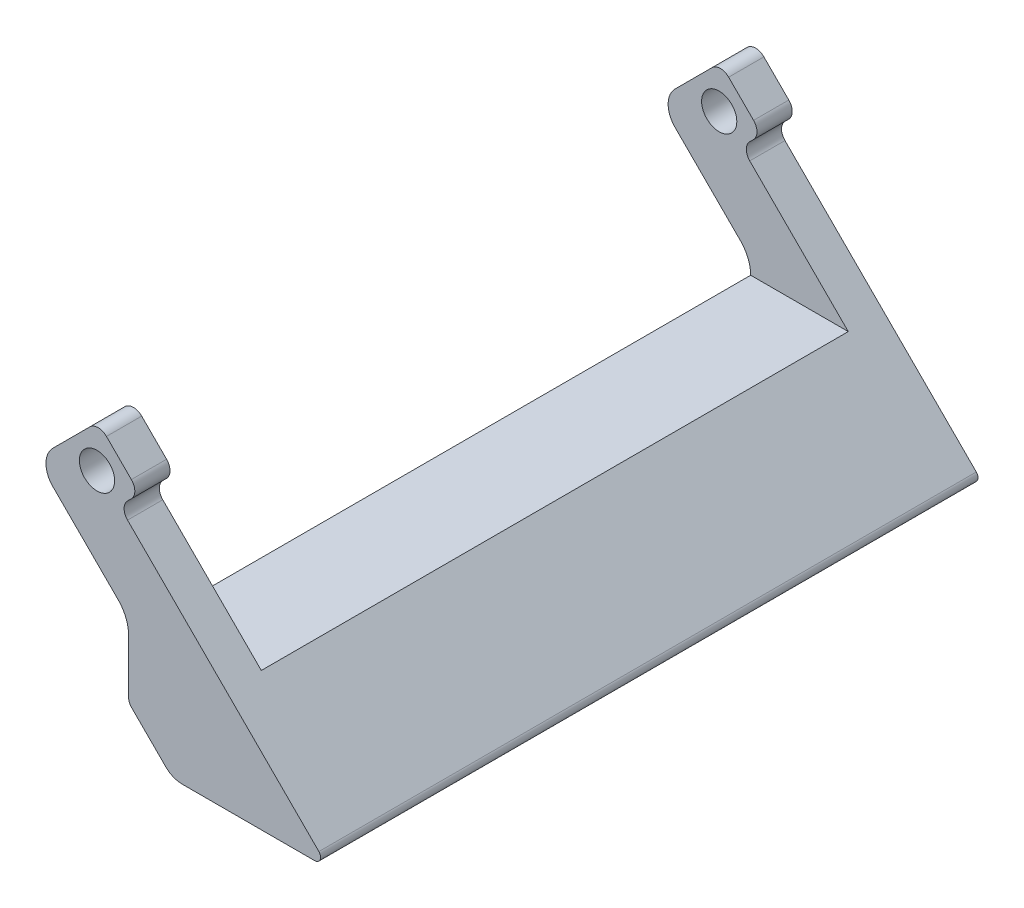
ISO-10303-21;
HEADER;
FILE_DESCRIPTION(('STEP AP214'),'2;1');
FILE_NAME('part.step','',(''),(''),'','','');
FILE_SCHEMA(('AUTOMOTIVE_DESIGN { 1 0 10303 214 1 1 1 1 }'));
ENDSEC;
DATA;
#1=APPLICATION_CONTEXT('core data for automotive mechanical design processes');
#2=APPLICATION_PROTOCOL_DEFINITION('international standard','automotive_design',2000,#1);
#3=PRODUCT_CONTEXT('',#1,'mechanical');
#4=PRODUCT('Part','Part','',(#3));
#5=PRODUCT_RELATED_PRODUCT_CATEGORY('part','',(#4));
#6=PRODUCT_DEFINITION_FORMATION('','',#4);
#7=PRODUCT_DEFINITION_CONTEXT('part definition',#1,'design');
#8=PRODUCT_DEFINITION('design','',#6,#7);
#9=PRODUCT_DEFINITION_SHAPE('','',#8);
#10=(LENGTH_UNIT() NAMED_UNIT(*) SI_UNIT(.MILLI.,.METRE.));
#11=(NAMED_UNIT(*) PLANE_ANGLE_UNIT() SI_UNIT($,.RADIAN.));
#12=(NAMED_UNIT(*) SI_UNIT($,.STERADIAN.) SOLID_ANGLE_UNIT());
#13=UNCERTAINTY_MEASURE_WITH_UNIT(LENGTH_MEASURE(1.E-05),#10,'distance_accuracy_value','');
#14=(GEOMETRIC_REPRESENTATION_CONTEXT(3) GLOBAL_UNCERTAINTY_ASSIGNED_CONTEXT((#13)) GLOBAL_UNIT_ASSIGNED_CONTEXT((#10,
#11,#12)) REPRESENTATION_CONTEXT('',''));
#15=CARTESIAN_POINT('',(0.,0.,0.));
#16=DIRECTION('',(0.,0.,1.));
#17=DIRECTION('',(1.,0.,0.));
#18=AXIS2_PLACEMENT_3D('',#15,#16,#17);
#19=CARTESIAN_POINT('',(0.,0.,3.));
#20=DIRECTION('',(0.,0.,1.));
#21=DIRECTION('',(1.,0.,0.));
#22=AXIS2_PLACEMENT_3D('',#19,#20,#21);
#23=PLANE('',#22);
#24=CARTESIAN_POINT('',(0.,0.,3.));
#25=DIRECTION('',(0.,0.,1.));
#26=DIRECTION('',(1.,0.,0.));
#27=AXIS2_PLACEMENT_3D('',#24,#25,#26);
#28=CIRCLE('',#27,1.5);
#29=CARTESIAN_POINT('',(1.5,0.,3.));
#30=VERTEX_POINT('',#29);
#31=EDGE_CURVE('E338',#30,#30,#28,.T.);
#32=ORIENTED_EDGE('',*,*,#31,.F.);
#33=EDGE_LOOP('',(#32));
#34=FACE_BOUND('',#33,.T.);
#35=CARTESIAN_POINT('',(-0.317797590198112,-10.7426406871192,3.));
#36=DIRECTION('',(0.,0.,1.));
#37=DIRECTION('',(1.,0.,0.));
#38=AXIS2_PLACEMENT_3D('',#35,#36,#37);
#39=CIRCLE('',#38,3.);
#40=CARTESIAN_POINT('',(1.80352275336153,-8.62132034355954,3.));
#41=VERTEX_POINT('',#40);
#42=CARTESIAN_POINT('',(2.68220240980189,-10.7426406871192,3.));
#43=VERTEX_POINT('',#42);
#44=EDGE_CURVE('E345',#41,#43,#39,.F.);
#45=ORIENTED_EDGE('',*,*,#44,.T.);
#46=DIRECTION('',(1.,0.,0.));
#47=VECTOR('',#46,1.);
#48=CARTESIAN_POINT('',(0.,-10.7426406871192,3.));
#49=LINE('',#48,#47);
#50=CARTESIAN_POINT('',(10.9959109087866,-10.7426406871192,3.));
#51=VERTEX_POINT('',#50);
#52=EDGE_CURVE('E220',#43,#51,#49,.T.);
#53=ORIENTED_EDGE('',*,*,#52,.T.);
#54=DIRECTION('',(0.707106781186546,-0.707106781186549,0.));
#55=VECTOR('',#54,1.);
#56=CARTESIAN_POINT('',(0.126635110833742,0.126635110833742,3.));
#57=LINE('',#56,#55);
#58=CARTESIAN_POINT('',(2.60150884498665,-2.34823862331918,3.));
#59=VERTEX_POINT('',#58);
#60=EDGE_CURVE('E347',#59,#51,#57,.T.);
#61=ORIENTED_EDGE('',*,*,#60,.F.);
#62=CARTESIAN_POINT('',(3.3086156261732,-1.64113184213263,3.));
#63=DIRECTION('',(0.,0.,1.));
#64=DIRECTION('',(1.,0.,0.));
#65=AXIS2_PLACEMENT_3D('',#62,#63,#64);
#66=CIRCLE('',#65,1.);
#67=CARTESIAN_POINT('',(2.60150884498666,-0.934025060946084,3.));
#68=VERTEX_POINT('',#67);
#69=EDGE_CURVE('E350',#68,#59,#66,.T.);
#70=ORIENTED_EDGE('',*,*,#69,.F.);
#71=DIRECTION('',(0.707106781186547,0.707106781186548,0.));
#72=VECTOR('',#71,1.);
#73=CARTESIAN_POINT('',(1.76776695296637,-1.76776695296637,3.));
#74=LINE('',#73,#72);
#75=CARTESIAN_POINT('',(2.92742207411231,-0.608111831820434,3.));
#76=VERTEX_POINT('',#75);
#77=EDGE_CURVE('E353',#68,#76,#74,.T.);
#78=ORIENTED_EDGE('',*,*,#77,.T.);
#79=CARTESIAN_POINT('',(2.22031529292576,0.0989949493661127,3.));
#80=DIRECTION('',(0.,0.,1.));
#81=DIRECTION('',(1.,0.,0.));
#82=AXIS2_PLACEMENT_3D('',#79,#80,#81);
#83=CIRCLE('',#82,1.);
#84=CARTESIAN_POINT('',(2.92742207411231,0.806101730552661,3.));
#85=VERTEX_POINT('',#84);
#86=EDGE_CURVE('E355',#76,#85,#83,.T.);
#87=ORIENTED_EDGE('',*,*,#86,.T.);
#88=DIRECTION('',(-0.707106781186547,0.707106781186548,0.));
#89=VECTOR('',#88,1.);
#90=CARTESIAN_POINT('',(1.86676190233249,1.86676190233248,3.));
#91=LINE('',#90,#89);
#92=CARTESIAN_POINT('',(0.806101730552668,2.92742207411231,3.));
#93=VERTEX_POINT('',#92);
#94=EDGE_CURVE('E357',#85,#93,#91,.T.);
#95=ORIENTED_EDGE('',*,*,#94,.T.);
#96=CARTESIAN_POINT('',(0.0989949493661204,2.22031529292576,3.));
#97=DIRECTION('',(0.,0.,1.));
#98=DIRECTION('',(1.,0.,0.));
#99=AXIS2_PLACEMENT_3D('',#96,#97,#98);
#100=CIRCLE('',#99,1.);
#101=CARTESIAN_POINT('',(-0.608111831820427,2.92742207411231,3.));
#102=VERTEX_POINT('',#101);
#103=EDGE_CURVE('E359',#93,#102,#100,.T.);
#104=ORIENTED_EDGE('',*,*,#103,.T.);
#105=DIRECTION('',(-0.707106781186549,-0.707106781186547,0.));
#106=VECTOR('',#105,1.);
#107=CARTESIAN_POINT('',(-1.76776695296637,1.76776695296637,3.));
#108=LINE('',#107,#106);
#109=CARTESIAN_POINT('',(-3.76245218569227,-0.226918279759524,3.));
#110=VERTEX_POINT('',#109);
#111=EDGE_CURVE('E361',#102,#110,#108,.T.);
#112=ORIENTED_EDGE('',*,*,#111,.T.);
#113=CARTESIAN_POINT('',(-2.34823862331918,-1.64113184213262,3.));
#114=DIRECTION('',(0.,0.,1.));
#115=DIRECTION('',(1.,0.,0.));
#116=AXIS2_PLACEMENT_3D('',#113,#114,#115);
#117=CIRCLE('',#116,2.);
#118=CARTESIAN_POINT('',(-3.76245218569227,-3.05534540450571,3.));
#119=VERTEX_POINT('',#118);
#120=EDGE_CURVE('E363',#110,#119,#117,.T.);
#121=ORIENTED_EDGE('',*,*,#120,.T.);
#122=DIRECTION('',(0.707106781186546,-0.707106781186549,0.));
#123=VECTOR('',#122,1.);
#124=CARTESIAN_POINT('',(-3.408898795099,-3.40889879509899,3.));
#125=LINE('',#124,#123);
#126=EDGE_CURVE('E341',#119,#41,#125,.T.);
#127=ORIENTED_EDGE('',*,*,#126,.T.);
#128=EDGE_LOOP('',(#45,#53,#61,#70,#78,#87,#95,#104,#112,#121,#127));
#129=FACE_BOUND('',#128,.T.);
#130=ADVANCED_FACE('F35',(#34,#129),#23,.T.);
#131=CARTESIAN_POINT('',(-3.408898795099,-3.40889879509899,3.));
#132=DIRECTION('',(0.707106781186549,0.707106781186546,0.));
#133=DIRECTION('',(-0.707106781186546,0.707106781186549,0.));
#134=AXIS2_PLACEMENT_3D('',#131,#132,#133);
#135=PLANE('',#134);
#136=DIRECTION('',(0.707106781186546,-0.707106781186549,0.));
#137=VECTOR('',#136,1.);
#138=CARTESIAN_POINT('',(-3.408898795099,-3.40889879509899,0.));
#139=LINE('',#138,#137);
#140=CARTESIAN_POINT('',(-3.76245218569227,-3.05534540450571,0.));
#141=VERTEX_POINT('',#140);
#142=CARTESIAN_POINT('',(1.80352275336153,-8.62132034355954,0.));
#143=VERTEX_POINT('',#142);
#144=EDGE_CURVE('E368',#141,#143,#139,.T.);
#145=ORIENTED_EDGE('',*,*,#144,.T.);
#146=DIRECTION('',(0.,0.,-1.));
#147=VECTOR('',#146,1.);
#148=CARTESIAN_POINT('',(1.80352275336153,-8.62132034355954,3.));
#149=LINE('',#148,#147);
#150=EDGE_CURVE('E425',#41,#143,#149,.T.);
#151=ORIENTED_EDGE('',*,*,#150,.F.);
#152=ORIENTED_EDGE('',*,*,#126,.F.);
#153=DIRECTION('',(0.,0.,-1.));
#154=VECTOR('',#153,1.);
#155=CARTESIAN_POINT('',(-3.76245218569227,-3.05534540450571,3.));
#156=LINE('',#155,#154);
#157=EDGE_CURVE('E365',#119,#141,#156,.T.);
#158=ORIENTED_EDGE('',*,*,#157,.T.);
#159=EDGE_LOOP('',(#145,#151,#152,#158));
#160=FACE_BOUND('',#159,.T.);
#161=ADVANCED_FACE('F477',(#160),#135,.F.);
#162=CARTESIAN_POINT('',(-0.317797590198112,-10.7426406871192,3.));
#163=DIRECTION('',(0.,0.,-1.));
#164=DIRECTION('',(-1.,0.,0.));
#165=AXIS2_PLACEMENT_3D('',#162,#163,#164);
#166=CYLINDRICAL_SURFACE('',#165,3.);
#167=CARTESIAN_POINT('',(-0.317797590198112,-10.7426406871192,0.));
#168=DIRECTION('',(0.,0.,1.));
#169=DIRECTION('',(1.,0.,0.));
#170=AXIS2_PLACEMENT_3D('',#167,#168,#169);
#171=CIRCLE('',#170,3.);
#172=CARTESIAN_POINT('',(2.68220240980189,-10.7426406871192,0.));
#173=VERTEX_POINT('',#172);
#174=EDGE_CURVE('E371',#143,#173,#171,.F.);
#175=ORIENTED_EDGE('',*,*,#174,.T.);
#176=DIRECTION('',(0.,0.,-1.));
#177=VECTOR('',#176,1.);
#178=CARTESIAN_POINT('',(2.68220240980189,-10.7426406871192,3.));
#179=LINE('',#178,#177);
#180=EDGE_CURVE('E423',#43,#173,#179,.T.);
#181=ORIENTED_EDGE('',*,*,#180,.F.);
#182=ORIENTED_EDGE('',*,*,#44,.F.);
#183=ORIENTED_EDGE('',*,*,#150,.T.);
#184=EDGE_LOOP('',(#175,#181,#182,#183));
#185=FACE_BOUND('',#184,.T.);
#186=ADVANCED_FACE('F483',(#185),#166,.F.);
#187=CARTESIAN_POINT('',(2.68220240980189,0.,3.));
#188=DIRECTION('',(1.,0.,0.));
#189=DIRECTION('',(0.,0.,-1.));
#190=AXIS2_PLACEMENT_3D('',#187,#188,#189);
#191=PLANE('',#190);
#192=DIRECTION('',(0.,-1.,0.));
#193=VECTOR('',#192,1.);
#194=CARTESIAN_POINT('',(2.68220240980189,0.,0.));
#195=LINE('',#194,#193);
#196=CARTESIAN_POINT('',(2.68220240980189,-15.3284271247461,0.));
#197=VERTEX_POINT('',#196);
#198=EDGE_CURVE('E373',#173,#197,#195,.T.);
#199=ORIENTED_EDGE('',*,*,#198,.T.);
#200=DIRECTION('',(0.,0.,-1.));
#201=VECTOR('',#200,1.);
#202=CARTESIAN_POINT('',(2.68220240980189,-15.3284271247461,3.));
#203=LINE('',#202,#201);
#204=CARTESIAN_POINT('',(2.68220240980189,-15.3284271247461,56.));
#205=VERTEX_POINT('',#204);
#206=EDGE_CURVE('E43',#197,#205,#203,.F.);
#207=ORIENTED_EDGE('',*,*,#206,.T.);
#208=DIRECTION('',(0.,-1.,0.));
#209=VECTOR('',#208,1.);
#210=CARTESIAN_POINT('',(2.68220240980189,0.,56.));
#211=LINE('',#210,#209);
#212=CARTESIAN_POINT('',(2.68220240980189,-10.7426406871192,56.));
#213=VERTEX_POINT('',#212);
#214=EDGE_CURVE('E229',#213,#205,#211,.T.);
#215=ORIENTED_EDGE('',*,*,#214,.F.);
#216=DIRECTION('',(0.,0.,1.));
#217=VECTOR('',#216,1.);
#218=CARTESIAN_POINT('',(2.68220240980189,-10.7426406871192,53.));
#219=LINE('',#218,#217);
#220=CARTESIAN_POINT('',(2.68220240980189,-10.7426406871192,53.));
#221=VERTEX_POINT('',#220);
#222=EDGE_CURVE('E227',#221,#213,#219,.T.);
#223=ORIENTED_EDGE('',*,*,#222,.F.);
#224=DIRECTION('',(0.,0.,-1.));
#225=VECTOR('',#224,1.);
#226=CARTESIAN_POINT('',(2.68220240980189,-10.7426406871192,28.));
#227=LINE('',#226,#225);
#228=EDGE_CURVE('E213',#221,#43,#227,.T.);
#229=ORIENTED_EDGE('',*,*,#228,.T.);
#230=ORIENTED_EDGE('',*,*,#180,.T.);
#231=EDGE_LOOP('',(#199,#207,#215,#223,#229,#230));
#232=FACE_BOUND('',#231,.T.);
#233=ADVANCED_FACE('F228',(#232),#191,.F.);
#234=CARTESIAN_POINT('',(0.,-19.5,3.));
#235=DIRECTION('',(0.,1.,0.));
#236=DIRECTION('',(-1.,0.,0.));
#237=AXIS2_PLACEMENT_3D('',#234,#235,#236);
#238=PLANE('',#237);
#239=DIRECTION('',(1.,0.,0.));
#240=VECTOR('',#239,1.);
#241=CARTESIAN_POINT('',(0.,-19.5,56.));
#242=LINE('',#241,#240);
#243=CARTESIAN_POINT('',(7.26798884742889,-19.5,56.));
#244=VERTEX_POINT('',#243);
#245=CARTESIAN_POINT('',(18.5461634404809,-19.5,56.));
#246=VERTEX_POINT('',#245);
#247=EDGE_CURVE('E286',#244,#246,#242,.T.);
#248=ORIENTED_EDGE('',*,*,#247,.F.);
#249=DIRECTION('',(0.,0.,-1.));
#250=VECTOR('',#249,1.);
#251=CARTESIAN_POINT('',(7.26798884742889,-19.5,3.));
#252=LINE('',#251,#250);
#253=CARTESIAN_POINT('',(7.26798884742889,-19.5,0.));
#254=VERTEX_POINT('',#253);
#255=EDGE_CURVE('E430',#244,#254,#252,.T.);
#256=ORIENTED_EDGE('',*,*,#255,.T.);
#257=DIRECTION('',(1.,0.,0.));
#258=VECTOR('',#257,1.);
#259=CARTESIAN_POINT('',(0.,-19.5,0.));
#260=LINE('',#259,#258);
#261=CARTESIAN_POINT('',(18.5461634404809,-19.5,0.));
#262=VERTEX_POINT('',#261);
#263=EDGE_CURVE('E375',#254,#262,#260,.T.);
#264=ORIENTED_EDGE('',*,*,#263,.T.);
#265=DIRECTION('',(0.,0.,-1.));
#266=VECTOR('',#265,1.);
#267=CARTESIAN_POINT('',(18.5461634404809,-19.5,3.));
#268=LINE('',#267,#266);
#269=EDGE_CURVE('E420',#246,#262,#268,.T.);
#270=ORIENTED_EDGE('',*,*,#269,.F.);
#271=EDGE_LOOP('',(#248,#256,#264,#270));
#272=FACE_BOUND('',#271,.T.);
#273=ADVANCED_FACE('F529',(#272),#238,.F.);
#274=CARTESIAN_POINT('',(18.5461634404809,-19.,3.));
#275=DIRECTION('',(0.,0.,-1.));
#276=DIRECTION('',(-1.,0.,0.));
#277=AXIS2_PLACEMENT_3D('',#274,#275,#276);
#278=CYLINDRICAL_SURFACE('',#277,0.500000000000003);
#279=CARTESIAN_POINT('',(18.5461634404809,-19.,0.));
#280=DIRECTION('',(0.,0.,1.));
#281=DIRECTION('',(1.,0.,0.));
#282=AXIS2_PLACEMENT_3D('',#279,#280,#281);
#283=CIRCLE('',#282,0.500000000000003);
#284=CARTESIAN_POINT('',(18.8997168310742,-18.6464466094067,0.));
#285=VERTEX_POINT('',#284);
#286=EDGE_CURVE('E377',#262,#285,#283,.T.);
#287=ORIENTED_EDGE('',*,*,#286,.T.);
#288=DIRECTION('',(0.,0.,-1.));
#289=VECTOR('',#288,1.);
#290=CARTESIAN_POINT('',(18.8997168310742,-18.6464466094067,3.));
#291=LINE('',#290,#289);
#292=CARTESIAN_POINT('',(18.8997168310742,-18.6464466094067,56.));
#293=VERTEX_POINT('',#292);
#294=EDGE_CURVE('E418',#293,#285,#291,.T.);
#295=ORIENTED_EDGE('',*,*,#294,.F.);
#296=CARTESIAN_POINT('',(18.5461634404809,-19.,56.));
#297=DIRECTION('',(0.,0.,1.));
#298=DIRECTION('',(1.,0.,0.));
#299=AXIS2_PLACEMENT_3D('',#296,#297,#298);
#300=CIRCLE('',#299,0.500000000000003);
#301=EDGE_CURVE('E288',#246,#293,#300,.T.);
#302=ORIENTED_EDGE('',*,*,#301,.F.);
#303=ORIENTED_EDGE('',*,*,#269,.T.);
#304=EDGE_LOOP('',(#287,#295,#302,#303));
#305=FACE_BOUND('',#304,.T.);
#306=ADVANCED_FACE('F525',(#305),#278,.T.);
#307=CARTESIAN_POINT('',(0.126635110833742,0.126635110833742,3.));
#308=DIRECTION('',(0.707106781186548,0.707106781186546,0.));
#309=DIRECTION('',(-0.707106781186546,0.707106781186549,0.));
#310=AXIS2_PLACEMENT_3D('',#307,#308,#309);
#311=PLANE('',#310);
#312=DIRECTION('',(0.707106781186546,-0.707106781186549,0.));
#313=VECTOR('',#312,1.);
#314=CARTESIAN_POINT('',(0.126635110833742,0.126635110833742,0.));
#315=LINE('',#314,#313);
#316=CARTESIAN_POINT('',(2.60150884498665,-2.34823862331918,0.));
#317=VERTEX_POINT('',#316);
#318=EDGE_CURVE('E380',#317,#285,#315,.T.);
#319=ORIENTED_EDGE('',*,*,#318,.F.);
#320=DIRECTION('',(0.,0.,-1.));
#321=VECTOR('',#320,1.);
#322=CARTESIAN_POINT('',(2.60150884498665,-2.34823862331918,3.));
#323=LINE('',#322,#321);
#324=EDGE_CURVE('E416',#59,#317,#323,.T.);
#325=ORIENTED_EDGE('',*,*,#324,.F.);
#326=ORIENTED_EDGE('',*,*,#60,.T.);
#327=DIRECTION('',(0.,0.,-1.));
#328=VECTOR('',#327,1.);
#329=CARTESIAN_POINT('',(10.9959109087866,-10.7426406871192,28.));
#330=LINE('',#329,#328);
#331=CARTESIAN_POINT('',(10.9959109087866,-10.7426406871192,53.));
#332=VERTEX_POINT('',#331);
#333=EDGE_CURVE('E224',#332,#51,#330,.T.);
#334=ORIENTED_EDGE('',*,*,#333,.F.);
#335=DIRECTION('',(0.707106781186546,-0.707106781186549,0.));
#336=VECTOR('',#335,1.);
#337=CARTESIAN_POINT('',(0.126635110833742,0.126635110833742,53.));
#338=LINE('',#337,#336);
#339=CARTESIAN_POINT('',(2.60150884498665,-2.34823862331918,53.));
#340=VERTEX_POINT('',#339);
#341=EDGE_CURVE('E243',#340,#332,#338,.T.);
#342=ORIENTED_EDGE('',*,*,#341,.F.);
#343=DIRECTION('',(0.,0.,1.));
#344=VECTOR('',#343,1.);
#345=CARTESIAN_POINT('',(2.60150884498665,-2.34823862331918,53.));
#346=LINE('',#345,#344);
#347=CARTESIAN_POINT('',(2.60150884498665,-2.34823862331918,56.));
#348=VERTEX_POINT('',#347);
#349=EDGE_CURVE('E234',#340,#348,#346,.T.);
#350=ORIENTED_EDGE('',*,*,#349,.T.);
#351=DIRECTION('',(0.707106781186546,-0.707106781186549,0.));
#352=VECTOR('',#351,1.);
#353=CARTESIAN_POINT('',(0.126635110833742,0.126635110833742,56.));
#354=LINE('',#353,#352);
#355=EDGE_CURVE('E291',#348,#293,#354,.T.);
#356=ORIENTED_EDGE('',*,*,#355,.T.);
#357=ORIENTED_EDGE('',*,*,#294,.T.);
#358=EDGE_LOOP('',(#319,#325,#326,#334,#342,#350,#356,#357));
#359=FACE_BOUND('',#358,.T.);
#360=ADVANCED_FACE('F521',(#359),#311,.T.);
#361=CARTESIAN_POINT('',(3.3086156261732,-1.64113184213263,3.));
#362=DIRECTION('',(0.,0.,-1.));
#363=DIRECTION('',(-1.,0.,0.));
#364=AXIS2_PLACEMENT_3D('',#361,#362,#363);
#365=CYLINDRICAL_SURFACE('',#364,1.);
#366=CARTESIAN_POINT('',(3.3086156261732,-1.64113184213263,0.));
#367=DIRECTION('',(0.,0.,1.));
#368=DIRECTION('',(1.,0.,0.));
#369=AXIS2_PLACEMENT_3D('',#366,#367,#368);
#370=CIRCLE('',#369,1.);
#371=CARTESIAN_POINT('',(2.60150884498666,-0.934025060946084,0.));
#372=VERTEX_POINT('',#371);
#373=EDGE_CURVE('E383',#372,#317,#370,.T.);
#374=ORIENTED_EDGE('',*,*,#373,.F.);
#375=DIRECTION('',(0.,0.,-1.));
#376=VECTOR('',#375,1.);
#377=CARTESIAN_POINT('',(2.60150884498666,-0.934025060946084,3.));
#378=LINE('',#377,#376);
#379=EDGE_CURVE('E414',#68,#372,#378,.T.);
#380=ORIENTED_EDGE('',*,*,#379,.F.);
#381=ORIENTED_EDGE('',*,*,#69,.T.);
#382=ORIENTED_EDGE('',*,*,#324,.T.);
#383=EDGE_LOOP('',(#374,#380,#381,#382));
#384=FACE_BOUND('',#383,.T.);
#385=ADVANCED_FACE('F517',(#384),#365,.F.);
#386=CARTESIAN_POINT('',(1.76776695296637,-1.76776695296637,3.));
#387=DIRECTION('',(-0.707106781186548,0.707106781186547,0.));
#388=DIRECTION('',(-0.707106781186547,-0.707106781186548,0.));
#389=AXIS2_PLACEMENT_3D('',#386,#387,#388);
#390=PLANE('',#389);
#391=DIRECTION('',(0.707106781186547,0.707106781186548,0.));
#392=VECTOR('',#391,1.);
#393=CARTESIAN_POINT('',(1.76776695296637,-1.76776695296637,0.));
#394=LINE('',#393,#392);
#395=CARTESIAN_POINT('',(2.92742207411231,-0.608111831820434,0.));
#396=VERTEX_POINT('',#395);
#397=EDGE_CURVE('E386',#372,#396,#394,.T.);
#398=ORIENTED_EDGE('',*,*,#397,.T.);
#399=DIRECTION('',(0.,0.,-1.));
#400=VECTOR('',#399,1.);
#401=CARTESIAN_POINT('',(2.92742207411231,-0.608111831820434,3.));
#402=LINE('',#401,#400);
#403=EDGE_CURVE('E411',#76,#396,#402,.T.);
#404=ORIENTED_EDGE('',*,*,#403,.F.);
#405=ORIENTED_EDGE('',*,*,#77,.F.);
#406=ORIENTED_EDGE('',*,*,#379,.T.);
#407=EDGE_LOOP('',(#398,#404,#405,#406));
#408=FACE_BOUND('',#407,.T.);
#409=ADVANCED_FACE('F513',(#408),#390,.F.);
#410=CARTESIAN_POINT('',(2.22031529292576,0.0989949493661127,3.));
#411=DIRECTION('',(0.,0.,-1.));
#412=DIRECTION('',(-1.,0.,0.));
#413=AXIS2_PLACEMENT_3D('',#410,#411,#412);
#414=CYLINDRICAL_SURFACE('',#413,1.);
#415=CARTESIAN_POINT('',(2.22031529292576,0.0989949493661127,0.));
#416=DIRECTION('',(0.,0.,1.));
#417=DIRECTION('',(1.,0.,0.));
#418=AXIS2_PLACEMENT_3D('',#415,#416,#417);
#419=CIRCLE('',#418,1.);
#420=CARTESIAN_POINT('',(2.92742207411231,0.806101730552661,0.));
#421=VERTEX_POINT('',#420);
#422=EDGE_CURVE('E388',#396,#421,#419,.T.);
#423=ORIENTED_EDGE('',*,*,#422,.T.);
#424=DIRECTION('',(0.,0.,-1.));
#425=VECTOR('',#424,1.);
#426=CARTESIAN_POINT('',(2.92742207411231,0.806101730552661,3.));
#427=LINE('',#426,#425);
#428=EDGE_CURVE('E408',#85,#421,#427,.T.);
#429=ORIENTED_EDGE('',*,*,#428,.F.);
#430=ORIENTED_EDGE('',*,*,#86,.F.);
#431=ORIENTED_EDGE('',*,*,#403,.T.);
#432=EDGE_LOOP('',(#423,#429,#430,#431));
#433=FACE_BOUND('',#432,.T.);
#434=ADVANCED_FACE('F509',(#433),#414,.T.);
#435=CARTESIAN_POINT('',(1.86676190233249,1.86676190233248,3.));
#436=DIRECTION('',(-0.707106781186548,-0.707106781186547,0.));
#437=DIRECTION('',(0.707106781186547,-0.707106781186548,0.));
#438=AXIS2_PLACEMENT_3D('',#435,#436,#437);
#439=PLANE('',#438);
#440=DIRECTION('',(-0.707106781186547,0.707106781186548,0.));
#441=VECTOR('',#440,1.);
#442=CARTESIAN_POINT('',(1.86676190233249,1.86676190233248,0.));
#443=LINE('',#442,#441);
#444=CARTESIAN_POINT('',(0.806101730552668,2.92742207411231,0.));
#445=VERTEX_POINT('',#444);
#446=EDGE_CURVE('E390',#421,#445,#443,.T.);
#447=ORIENTED_EDGE('',*,*,#446,.T.);
#448=DIRECTION('',(0.,0.,-1.));
#449=VECTOR('',#448,1.);
#450=CARTESIAN_POINT('',(0.806101730552668,2.92742207411231,3.));
#451=LINE('',#450,#449);
#452=EDGE_CURVE('E405',#93,#445,#451,.T.);
#453=ORIENTED_EDGE('',*,*,#452,.F.);
#454=ORIENTED_EDGE('',*,*,#94,.F.);
#455=ORIENTED_EDGE('',*,*,#428,.T.);
#456=EDGE_LOOP('',(#447,#453,#454,#455));
#457=FACE_BOUND('',#456,.T.);
#458=ADVANCED_FACE('F505',(#457),#439,.F.);
#459=CARTESIAN_POINT('',(0.0989949493661204,2.22031529292576,3.));
#460=DIRECTION('',(0.,0.,-1.));
#461=DIRECTION('',(-1.,0.,0.));
#462=AXIS2_PLACEMENT_3D('',#459,#460,#461);
#463=CYLINDRICAL_SURFACE('',#462,1.);
#464=CARTESIAN_POINT('',(0.0989949493661204,2.22031529292576,0.));
#465=DIRECTION('',(0.,0.,1.));
#466=DIRECTION('',(1.,0.,0.));
#467=AXIS2_PLACEMENT_3D('',#464,#465,#466);
#468=CIRCLE('',#467,1.);
#469=CARTESIAN_POINT('',(-0.608111831820427,2.92742207411231,0.));
#470=VERTEX_POINT('',#469);
#471=EDGE_CURVE('E392',#445,#470,#468,.T.);
#472=ORIENTED_EDGE('',*,*,#471,.T.);
#473=DIRECTION('',(0.,0.,-1.));
#474=VECTOR('',#473,1.);
#475=CARTESIAN_POINT('',(-0.608111831820427,2.92742207411231,3.));
#476=LINE('',#475,#474);
#477=EDGE_CURVE('E402',#102,#470,#476,.T.);
#478=ORIENTED_EDGE('',*,*,#477,.F.);
#479=ORIENTED_EDGE('',*,*,#103,.F.);
#480=ORIENTED_EDGE('',*,*,#452,.T.);
#481=EDGE_LOOP('',(#472,#478,#479,#480));
#482=FACE_BOUND('',#481,.T.);
#483=ADVANCED_FACE('F501',(#482),#463,.T.);
#484=CARTESIAN_POINT('',(-1.76776695296637,1.76776695296637,3.));
#485=DIRECTION('',(0.707106781186546,-0.707106781186548,0.));
#486=DIRECTION('',(0.707106781186549,0.707106781186547,0.));
#487=AXIS2_PLACEMENT_3D('',#484,#485,#486);
#488=PLANE('',#487);
#489=DIRECTION('',(-0.707106781186549,-0.707106781186547,0.));
#490=VECTOR('',#489,1.);
#491=CARTESIAN_POINT('',(-1.76776695296637,1.76776695296637,0.));
#492=LINE('',#491,#490);
#493=CARTESIAN_POINT('',(-3.76245218569227,-0.226918279759524,0.));
#494=VERTEX_POINT('',#493);
#495=EDGE_CURVE('E394',#470,#494,#492,.T.);
#496=ORIENTED_EDGE('',*,*,#495,.T.);
#497=DIRECTION('',(0.,0.,-1.));
#498=VECTOR('',#497,1.);
#499=CARTESIAN_POINT('',(-3.76245218569227,-0.226918279759524,3.));
#500=LINE('',#499,#498);
#501=EDGE_CURVE('E399',#110,#494,#500,.T.);
#502=ORIENTED_EDGE('',*,*,#501,.F.);
#503=ORIENTED_EDGE('',*,*,#111,.F.);
#504=ORIENTED_EDGE('',*,*,#477,.T.);
#505=EDGE_LOOP('',(#496,#502,#503,#504));
#506=FACE_BOUND('',#505,.T.);
#507=ADVANCED_FACE('F498',(#506),#488,.F.);
#508=CARTESIAN_POINT('',(0.,0.,3.));
#509=DIRECTION('',(0.,0.,-1.));
#510=DIRECTION('',(-1.,0.,0.));
#511=AXIS2_PLACEMENT_3D('',#508,#509,#510);
#512=CYLINDRICAL_SURFACE('',#511,1.5);
#513=ORIENTED_EDGE('',*,*,#31,.T.);
#514=EDGE_LOOP('',(#513));
#515=FACE_BOUND('',#514,.T.);
#516=CARTESIAN_POINT('',(0.,0.,0.));
#517=DIRECTION('',(0.,0.,1.));
#518=DIRECTION('',(1.,0.,0.));
#519=AXIS2_PLACEMENT_3D('',#516,#517,#518);
#520=CIRCLE('',#519,1.5);
#521=CARTESIAN_POINT('',(1.5,0.,0.));
#522=VERTEX_POINT('',#521);
#523=EDGE_CURVE('E223',#522,#522,#520,.T.);
#524=ORIENTED_EDGE('',*,*,#523,.F.);
#525=EDGE_LOOP('',(#524));
#526=FACE_BOUND('',#525,.T.);
#527=ADVANCED_FACE('F496',(#515,#526),#512,.F.);
#528=CARTESIAN_POINT('',(-2.34823862331918,-1.64113184213262,3.));
#529=DIRECTION('',(0.,0.,-1.));
#530=DIRECTION('',(-1.,0.,0.));
#531=AXIS2_PLACEMENT_3D('',#528,#529,#530);
#532=CYLINDRICAL_SURFACE('',#531,2.);
#533=CARTESIAN_POINT('',(-2.34823862331918,-1.64113184213262,0.));
#534=DIRECTION('',(0.,0.,1.));
#535=DIRECTION('',(1.,0.,0.));
#536=AXIS2_PLACEMENT_3D('',#533,#534,#535);
#537=CIRCLE('',#536,2.);
#538=EDGE_CURVE('E342',#494,#141,#537,.T.);
#539=ORIENTED_EDGE('',*,*,#538,.T.);
#540=ORIENTED_EDGE('',*,*,#157,.F.);
#541=ORIENTED_EDGE('',*,*,#120,.F.);
#542=ORIENTED_EDGE('',*,*,#501,.T.);
#543=EDGE_LOOP('',(#539,#540,#541,#542));
#544=FACE_BOUND('',#543,.T.);
#545=ADVANCED_FACE('F492',(#544),#532,.T.);
#546=CARTESIAN_POINT('',(0.,0.,0.));
#547=DIRECTION('',(0.,0.,1.));
#548=DIRECTION('',(1.,0.,0.));
#549=AXIS2_PLACEMENT_3D('',#546,#547,#548);
#550=PLANE('',#549);
#551=ORIENTED_EDGE('',*,*,#523,.T.);
#552=EDGE_LOOP('',(#551));
#553=FACE_BOUND('',#552,.T.);
#554=DIRECTION('',(0.707106781186546,-0.707106781186548,0.));
#555=VECTOR('',#554,1.);
#556=CARTESIAN_POINT('',(2.68220240980189,-15.7426406871192,0.));
#557=LINE('',#556,#555);
#558=CARTESIAN_POINT('',(2.97509562861534,-16.0355339059326,0.));
#559=VERTEX_POINT('',#558);
#560=CARTESIAN_POINT('',(5.85377528505579,-18.9142135623731,0.));
#561=VERTEX_POINT('',#560);
#562=EDGE_CURVE('E245',#559,#561,#557,.T.);
#563=ORIENTED_EDGE('',*,*,#562,.F.);
#564=CARTESIAN_POINT('',(3.68220240980189,-15.3284271247461,0.));
#565=DIRECTION('',(0.,0.,1.));
#566=DIRECTION('',(1.,0.,0.));
#567=AXIS2_PLACEMENT_3D('',#564,#565,#566);
#568=CIRCLE('',#567,1.);
#569=EDGE_CURVE('E57',#559,#197,#568,.F.);
#570=ORIENTED_EDGE('',*,*,#569,.T.);
#571=ORIENTED_EDGE('',*,*,#198,.F.);
#572=ORIENTED_EDGE('',*,*,#174,.F.);
#573=ORIENTED_EDGE('',*,*,#144,.F.);
#574=ORIENTED_EDGE('',*,*,#538,.F.);
#575=ORIENTED_EDGE('',*,*,#495,.F.);
#576=ORIENTED_EDGE('',*,*,#471,.F.);
#577=ORIENTED_EDGE('',*,*,#446,.F.);
#578=ORIENTED_EDGE('',*,*,#422,.F.);
#579=ORIENTED_EDGE('',*,*,#397,.F.);
#580=ORIENTED_EDGE('',*,*,#373,.T.);
#581=ORIENTED_EDGE('',*,*,#318,.T.);
#582=ORIENTED_EDGE('',*,*,#286,.F.);
#583=ORIENTED_EDGE('',*,*,#263,.F.);
#584=CARTESIAN_POINT('',(7.26798884742889,-17.5,0.));
#585=DIRECTION('',(0.,0.,1.));
#586=DIRECTION('',(1.,0.,0.));
#587=AXIS2_PLACEMENT_3D('',#584,#585,#586);
#588=CIRCLE('',#587,2.);
#589=EDGE_CURVE('E433',#254,#561,#588,.F.);
#590=ORIENTED_EDGE('',*,*,#589,.T.);
#591=EDGE_LOOP('',(#563,#570,#571,#572,#573,#574,#575,#576,#577,#578,#579,#580,#581,#582,#583,#590));
#592=FACE_BOUND('',#591,.T.);
#593=ADVANCED_FACE('F450',(#553,#592),#550,.F.);
#594=CARTESIAN_POINT('',(0.,-10.7426406871192,28.));
#595=DIRECTION('',(0.,1.,0.));
#596=DIRECTION('',(0.,0.,1.));
#597=AXIS2_PLACEMENT_3D('',#594,#595,#596);
#598=PLANE('',#597);
#599=ORIENTED_EDGE('',*,*,#52,.F.);
#600=ORIENTED_EDGE('',*,*,#228,.F.);
#601=DIRECTION('',(1.,0.,0.));
#602=VECTOR('',#601,1.);
#603=CARTESIAN_POINT('',(0.,-10.7426406871192,53.));
#604=LINE('',#603,#602);
#605=EDGE_CURVE('E217',#221,#332,#604,.T.);
#606=ORIENTED_EDGE('',*,*,#605,.T.);
#607=ORIENTED_EDGE('',*,*,#333,.T.);
#608=EDGE_LOOP('',(#599,#600,#606,#607));
#609=FACE_BOUND('',#608,.T.);
#610=ADVANCED_FACE('F215',(#609),#598,.T.);
#611=CARTESIAN_POINT('',(0.,0.,53.));
#612=DIRECTION('',(0.,0.,-1.));
#613=DIRECTION('',(1.,0.,0.));
#614=AXIS2_PLACEMENT_3D('',#611,#612,#613);
#615=PLANE('',#614);
#616=CARTESIAN_POINT('',(0.,0.,53.));
#617=DIRECTION('',(0.,0.,1.));
#618=DIRECTION('',(1.,0.,0.));
#619=AXIS2_PLACEMENT_3D('',#616,#617,#618);
#620=CIRCLE('',#619,1.5);
#621=CARTESIAN_POINT('',(1.5,0.,53.));
#622=VERTEX_POINT('',#621);
#623=EDGE_CURVE('E254',#622,#622,#620,.T.);
#624=ORIENTED_EDGE('',*,*,#623,.T.);
#625=EDGE_LOOP('',(#624));
#626=FACE_BOUND('',#625,.T.);
#627=CARTESIAN_POINT('',(-0.317797590198112,-10.7426406871192,53.));
#628=DIRECTION('',(0.,0.,1.));
#629=DIRECTION('',(1.,0.,0.));
#630=AXIS2_PLACEMENT_3D('',#627,#628,#629);
#631=CIRCLE('',#630,3.);
#632=CARTESIAN_POINT('',(1.80352275336153,-8.62132034355954,53.));
#633=VERTEX_POINT('',#632);
#634=EDGE_CURVE('E240',#633,#221,#631,.F.);
#635=ORIENTED_EDGE('',*,*,#634,.F.);
#636=DIRECTION('',(0.707106781186546,-0.707106781186549,0.));
#637=VECTOR('',#636,1.);
#638=CARTESIAN_POINT('',(-3.408898795099,-3.40889879509899,53.));
#639=LINE('',#638,#637);
#640=CARTESIAN_POINT('',(-3.76245218569227,-3.05534540450571,53.));
#641=VERTEX_POINT('',#640);
#642=EDGE_CURVE('E250',#641,#633,#639,.T.);
#643=ORIENTED_EDGE('',*,*,#642,.F.);
#644=CARTESIAN_POINT('',(-2.34823862331918,-1.64113184213262,53.));
#645=DIRECTION('',(0.,0.,1.));
#646=DIRECTION('',(1.,0.,0.));
#647=AXIS2_PLACEMENT_3D('',#644,#645,#646);
#648=CIRCLE('',#647,2.);
#649=CARTESIAN_POINT('',(-3.76245218569227,-0.226918279759524,53.));
#650=VERTEX_POINT('',#649);
#651=EDGE_CURVE('E274',#650,#641,#648,.T.);
#652=ORIENTED_EDGE('',*,*,#651,.F.);
#653=DIRECTION('',(-0.707106781186549,-0.707106781186547,0.));
#654=VECTOR('',#653,1.);
#655=CARTESIAN_POINT('',(-1.76776695296637,1.76776695296637,53.));
#656=LINE('',#655,#654);
#657=CARTESIAN_POINT('',(-0.608111831820427,2.92742207411231,53.));
#658=VERTEX_POINT('',#657);
#659=EDGE_CURVE('E271',#658,#650,#656,.T.);
#660=ORIENTED_EDGE('',*,*,#659,.F.);
#661=CARTESIAN_POINT('',(0.0989949493661204,2.22031529292576,53.));
#662=DIRECTION('',(0.,0.,1.));
#663=DIRECTION('',(1.,0.,0.));
#664=AXIS2_PLACEMENT_3D('',#661,#662,#663);
#665=CIRCLE('',#664,1.);
#666=CARTESIAN_POINT('',(0.806101730552668,2.92742207411231,53.));
#667=VERTEX_POINT('',#666);
#668=EDGE_CURVE('E268',#667,#658,#665,.T.);
#669=ORIENTED_EDGE('',*,*,#668,.F.);
#670=DIRECTION('',(-0.707106781186547,0.707106781186548,0.));
#671=VECTOR('',#670,1.);
#672=CARTESIAN_POINT('',(1.86676190233249,1.86676190233248,53.));
#673=LINE('',#672,#671);
#674=CARTESIAN_POINT('',(2.92742207411231,0.806101730552661,53.));
#675=VERTEX_POINT('',#674);
#676=EDGE_CURVE('E265',#675,#667,#673,.T.);
#677=ORIENTED_EDGE('',*,*,#676,.F.);
#678=CARTESIAN_POINT('',(2.22031529292576,0.0989949493661127,53.));
#679=DIRECTION('',(0.,0.,1.));
#680=DIRECTION('',(1.,0.,0.));
#681=AXIS2_PLACEMENT_3D('',#678,#679,#680);
#682=CIRCLE('',#681,1.);
#683=CARTESIAN_POINT('',(2.92742207411231,-0.608111831820434,53.));
#684=VERTEX_POINT('',#683);
#685=EDGE_CURVE('E262',#684,#675,#682,.T.);
#686=ORIENTED_EDGE('',*,*,#685,.F.);
#687=DIRECTION('',(0.707106781186547,0.707106781186548,0.));
#688=VECTOR('',#687,1.);
#689=CARTESIAN_POINT('',(1.76776695296637,-1.76776695296637,53.));
#690=LINE('',#689,#688);
#691=CARTESIAN_POINT('',(2.60150884498666,-0.934025060946084,53.));
#692=VERTEX_POINT('',#691);
#693=EDGE_CURVE('E259',#692,#684,#690,.T.);
#694=ORIENTED_EDGE('',*,*,#693,.F.);
#695=CARTESIAN_POINT('',(3.3086156261732,-1.64113184213263,53.));
#696=DIRECTION('',(0.,0.,1.));
#697=DIRECTION('',(1.,0.,0.));
#698=AXIS2_PLACEMENT_3D('',#695,#696,#697);
#699=CIRCLE('',#698,1.);
#700=EDGE_CURVE('E252',#692,#340,#699,.T.);
#701=ORIENTED_EDGE('',*,*,#700,.T.);
#702=ORIENTED_EDGE('',*,*,#341,.T.);
#703=ORIENTED_EDGE('',*,*,#605,.F.);
#704=EDGE_LOOP('',(#635,#643,#652,#660,#669,#677,#686,#694,#701,#702,#703));
#705=FACE_BOUND('',#704,.T.);
#706=ADVANCED_FACE('F238',(#626,#705),#615,.T.);
#707=CARTESIAN_POINT('',(-3.408898795099,-3.40889879509899,53.));
#708=DIRECTION('',(0.707106781186549,0.707106781186546,0.));
#709=DIRECTION('',(-0.707106781186546,0.707106781186549,0.));
#710=AXIS2_PLACEMENT_3D('',#707,#708,#709);
#711=PLANE('',#710);
#712=DIRECTION('',(0.707106781186546,-0.707106781186549,0.));
#713=VECTOR('',#712,1.);
#714=CARTESIAN_POINT('',(-3.408898795099,-3.40889879509899,56.));
#715=LINE('',#714,#713);
#716=CARTESIAN_POINT('',(-3.76245218569227,-3.05534540450571,56.));
#717=VERTEX_POINT('',#716);
#718=CARTESIAN_POINT('',(1.80352275336153,-8.62132034355954,56.));
#719=VERTEX_POINT('',#718);
#720=EDGE_CURVE('E280',#717,#719,#715,.T.);
#721=ORIENTED_EDGE('',*,*,#720,.F.);
#722=DIRECTION('',(0.,0.,1.));
#723=VECTOR('',#722,1.);
#724=CARTESIAN_POINT('',(-3.76245218569227,-3.05534540450571,53.));
#725=LINE('',#724,#723);
#726=EDGE_CURVE('E277',#641,#717,#725,.T.);
#727=ORIENTED_EDGE('',*,*,#726,.F.);
#728=ORIENTED_EDGE('',*,*,#642,.T.);
#729=DIRECTION('',(0.,0.,1.));
#730=VECTOR('',#729,1.);
#731=CARTESIAN_POINT('',(1.80352275336153,-8.62132034355954,53.));
#732=LINE('',#731,#730);
#733=EDGE_CURVE('E233',#633,#719,#732,.T.);
#734=ORIENTED_EDGE('',*,*,#733,.T.);
#735=EDGE_LOOP('',(#721,#727,#728,#734));
#736=FACE_BOUND('',#735,.T.);
#737=ADVANCED_FACE('F569',(#736),#711,.F.);
#738=CARTESIAN_POINT('',(-0.317797590198112,-10.7426406871192,53.));
#739=DIRECTION('',(0.,0.,1.));
#740=DIRECTION('',(-1.,0.,0.));
#741=AXIS2_PLACEMENT_3D('',#738,#739,#740);
#742=CYLINDRICAL_SURFACE('',#741,3.);
#743=CARTESIAN_POINT('',(-0.317797590198112,-10.7426406871192,56.));
#744=DIRECTION('',(0.,0.,1.));
#745=DIRECTION('',(1.,0.,0.));
#746=AXIS2_PLACEMENT_3D('',#743,#744,#745);
#747=CIRCLE('',#746,3.);
#748=EDGE_CURVE('E283',#719,#213,#747,.F.);
#749=ORIENTED_EDGE('',*,*,#748,.F.);
#750=ORIENTED_EDGE('',*,*,#733,.F.);
#751=ORIENTED_EDGE('',*,*,#634,.T.);
#752=ORIENTED_EDGE('',*,*,#222,.T.);
#753=EDGE_LOOP('',(#749,#750,#751,#752));
#754=FACE_BOUND('',#753,.T.);
#755=ADVANCED_FACE('F247',(#754),#742,.F.);
#756=CARTESIAN_POINT('',(3.3086156261732,-1.64113184213263,53.));
#757=DIRECTION('',(0.,0.,1.));
#758=DIRECTION('',(-1.,0.,0.));
#759=AXIS2_PLACEMENT_3D('',#756,#757,#758);
#760=CYLINDRICAL_SURFACE('',#759,1.);
#761=CARTESIAN_POINT('',(3.3086156261732,-1.64113184213263,56.));
#762=DIRECTION('',(0.,0.,1.));
#763=DIRECTION('',(1.,0.,0.));
#764=AXIS2_PLACEMENT_3D('',#761,#762,#763);
#765=CIRCLE('',#764,1.);
#766=CARTESIAN_POINT('',(2.60150884498666,-0.934025060946084,56.));
#767=VERTEX_POINT('',#766);
#768=EDGE_CURVE('E294',#767,#348,#765,.T.);
#769=ORIENTED_EDGE('',*,*,#768,.T.);
#770=ORIENTED_EDGE('',*,*,#349,.F.);
#771=ORIENTED_EDGE('',*,*,#700,.F.);
#772=DIRECTION('',(0.,0.,1.));
#773=VECTOR('',#772,1.);
#774=CARTESIAN_POINT('',(2.60150884498666,-0.934025060946084,53.));
#775=LINE('',#774,#773);
#776=EDGE_CURVE('E330',#692,#767,#775,.T.);
#777=ORIENTED_EDGE('',*,*,#776,.T.);
#778=EDGE_LOOP('',(#769,#770,#771,#777));
#779=FACE_BOUND('',#778,.T.);
#780=ADVANCED_FACE('F583',(#779),#760,.F.);
#781=CARTESIAN_POINT('',(1.76776695296637,-1.76776695296637,53.));
#782=DIRECTION('',(-0.707106781186548,0.707106781186547,0.));
#783=DIRECTION('',(-0.707106781186547,-0.707106781186548,0.));
#784=AXIS2_PLACEMENT_3D('',#781,#782,#783);
#785=PLANE('',#784);
#786=DIRECTION('',(0.707106781186547,0.707106781186548,0.));
#787=VECTOR('',#786,1.);
#788=CARTESIAN_POINT('',(1.76776695296637,-1.76776695296637,56.));
#789=LINE('',#788,#787);
#790=CARTESIAN_POINT('',(2.92742207411231,-0.608111831820434,56.));
#791=VERTEX_POINT('',#790);
#792=EDGE_CURVE('E296',#767,#791,#789,.T.);
#793=ORIENTED_EDGE('',*,*,#792,.F.);
#794=ORIENTED_EDGE('',*,*,#776,.F.);
#795=ORIENTED_EDGE('',*,*,#693,.T.);
#796=DIRECTION('',(0.,0.,1.));
#797=VECTOR('',#796,1.);
#798=CARTESIAN_POINT('',(2.92742207411231,-0.608111831820434,53.));
#799=LINE('',#798,#797);
#800=EDGE_CURVE('E327',#684,#791,#799,.T.);
#801=ORIENTED_EDGE('',*,*,#800,.T.);
#802=EDGE_LOOP('',(#793,#794,#795,#801));
#803=FACE_BOUND('',#802,.T.);
#804=ADVANCED_FACE('F590',(#803),#785,.F.);
#805=CARTESIAN_POINT('',(2.22031529292576,0.0989949493661127,53.));
#806=DIRECTION('',(0.,0.,1.));
#807=DIRECTION('',(-1.,0.,0.));
#808=AXIS2_PLACEMENT_3D('',#805,#806,#807);
#809=CYLINDRICAL_SURFACE('',#808,1.);
#810=CARTESIAN_POINT('',(2.22031529292576,0.0989949493661127,56.));
#811=DIRECTION('',(0.,0.,1.));
#812=DIRECTION('',(1.,0.,0.));
#813=AXIS2_PLACEMENT_3D('',#810,#811,#812);
#814=CIRCLE('',#813,1.);
#815=CARTESIAN_POINT('',(2.92742207411231,0.806101730552661,56.));
#816=VERTEX_POINT('',#815);
#817=EDGE_CURVE('E299',#791,#816,#814,.T.);
#818=ORIENTED_EDGE('',*,*,#817,.F.);
#819=ORIENTED_EDGE('',*,*,#800,.F.);
#820=ORIENTED_EDGE('',*,*,#685,.T.);
#821=DIRECTION('',(0.,0.,1.));
#822=VECTOR('',#821,1.);
#823=CARTESIAN_POINT('',(2.92742207411231,0.806101730552661,53.));
#824=LINE('',#823,#822);
#825=EDGE_CURVE('E324',#675,#816,#824,.T.);
#826=ORIENTED_EDGE('',*,*,#825,.T.);
#827=EDGE_LOOP('',(#818,#819,#820,#826));
#828=FACE_BOUND('',#827,.T.);
#829=ADVANCED_FACE('F598',(#828),#809,.T.);
#830=CARTESIAN_POINT('',(1.86676190233249,1.86676190233248,53.));
#831=DIRECTION('',(-0.707106781186548,-0.707106781186547,0.));
#832=DIRECTION('',(0.707106781186547,-0.707106781186548,0.));
#833=AXIS2_PLACEMENT_3D('',#830,#831,#832);
#834=PLANE('',#833);
#835=DIRECTION('',(-0.707106781186547,0.707106781186548,0.));
#836=VECTOR('',#835,1.);
#837=CARTESIAN_POINT('',(1.86676190233249,1.86676190233248,56.));
#838=LINE('',#837,#836);
#839=CARTESIAN_POINT('',(0.806101730552668,2.92742207411231,56.));
#840=VERTEX_POINT('',#839);
#841=EDGE_CURVE('E302',#816,#840,#838,.T.);
#842=ORIENTED_EDGE('',*,*,#841,.F.);
#843=ORIENTED_EDGE('',*,*,#825,.F.);
#844=ORIENTED_EDGE('',*,*,#676,.T.);
#845=DIRECTION('',(0.,0.,1.));
#846=VECTOR('',#845,1.);
#847=CARTESIAN_POINT('',(0.806101730552668,2.92742207411231,53.));
#848=LINE('',#847,#846);
#849=EDGE_CURVE('E321',#667,#840,#848,.T.);
#850=ORIENTED_EDGE('',*,*,#849,.T.);
#851=EDGE_LOOP('',(#842,#843,#844,#850));
#852=FACE_BOUND('',#851,.T.);
#853=ADVANCED_FACE('F606',(#852),#834,.F.);
#854=CARTESIAN_POINT('',(0.0989949493661204,2.22031529292576,53.));
#855=DIRECTION('',(0.,0.,1.));
#856=DIRECTION('',(-1.,0.,0.));
#857=AXIS2_PLACEMENT_3D('',#854,#855,#856);
#858=CYLINDRICAL_SURFACE('',#857,1.);
#859=CARTESIAN_POINT('',(0.0989949493661204,2.22031529292576,56.));
#860=DIRECTION('',(0.,0.,1.));
#861=DIRECTION('',(1.,0.,0.));
#862=AXIS2_PLACEMENT_3D('',#859,#860,#861);
#863=CIRCLE('',#862,1.);
#864=CARTESIAN_POINT('',(-0.608111831820427,2.92742207411231,56.));
#865=VERTEX_POINT('',#864);
#866=EDGE_CURVE('E305',#840,#865,#863,.T.);
#867=ORIENTED_EDGE('',*,*,#866,.F.);
#868=ORIENTED_EDGE('',*,*,#849,.F.);
#869=ORIENTED_EDGE('',*,*,#668,.T.);
#870=DIRECTION('',(0.,0.,1.));
#871=VECTOR('',#870,1.);
#872=CARTESIAN_POINT('',(-0.608111831820427,2.92742207411231,53.));
#873=LINE('',#872,#871);
#874=EDGE_CURVE('E318',#658,#865,#873,.T.);
#875=ORIENTED_EDGE('',*,*,#874,.T.);
#876=EDGE_LOOP('',(#867,#868,#869,#875));
#877=FACE_BOUND('',#876,.T.);
#878=ADVANCED_FACE('F614',(#877),#858,.T.);
#879=CARTESIAN_POINT('',(-1.76776695296637,1.76776695296637,53.));
#880=DIRECTION('',(0.707106781186546,-0.707106781186548,0.));
#881=DIRECTION('',(0.707106781186549,0.707106781186547,0.));
#882=AXIS2_PLACEMENT_3D('',#879,#880,#881);
#883=PLANE('',#882);
#884=DIRECTION('',(-0.707106781186549,-0.707106781186547,0.));
#885=VECTOR('',#884,1.);
#886=CARTESIAN_POINT('',(-1.76776695296637,1.76776695296637,56.));
#887=LINE('',#886,#885);
#888=CARTESIAN_POINT('',(-3.76245218569227,-0.226918279759524,56.));
#889=VERTEX_POINT('',#888);
#890=EDGE_CURVE('E308',#865,#889,#887,.T.);
#891=ORIENTED_EDGE('',*,*,#890,.F.);
#892=ORIENTED_EDGE('',*,*,#874,.F.);
#893=ORIENTED_EDGE('',*,*,#659,.T.);
#894=DIRECTION('',(0.,0.,1.));
#895=VECTOR('',#894,1.);
#896=CARTESIAN_POINT('',(-3.76245218569227,-0.226918279759524,53.));
#897=LINE('',#896,#895);
#898=EDGE_CURVE('E315',#650,#889,#897,.T.);
#899=ORIENTED_EDGE('',*,*,#898,.T.);
#900=EDGE_LOOP('',(#891,#892,#893,#899));
#901=FACE_BOUND('',#900,.T.);
#902=ADVANCED_FACE('F462',(#901),#883,.F.);
#903=CARTESIAN_POINT('',(0.,0.,53.));
#904=DIRECTION('',(0.,0.,1.));
#905=DIRECTION('',(-1.,0.,0.));
#906=AXIS2_PLACEMENT_3D('',#903,#904,#905);
#907=CYLINDRICAL_SURFACE('',#906,1.5);
#908=ORIENTED_EDGE('',*,*,#623,.F.);
#909=EDGE_LOOP('',(#908));
#910=FACE_BOUND('',#909,.T.);
#911=CARTESIAN_POINT('',(0.,0.,56.));
#912=DIRECTION('',(0.,0.,1.));
#913=DIRECTION('',(1.,0.,0.));
#914=AXIS2_PLACEMENT_3D('',#911,#912,#913);
#915=CIRCLE('',#914,1.5);
#916=CARTESIAN_POINT('',(1.5,0.,56.));
#917=VERTEX_POINT('',#916);
#918=EDGE_CURVE('E244',#917,#917,#915,.T.);
#919=ORIENTED_EDGE('',*,*,#918,.T.);
#920=EDGE_LOOP('',(#919));
#921=FACE_BOUND('',#920,.T.);
#922=ADVANCED_FACE('F458',(#910,#921),#907,.F.);
#923=CARTESIAN_POINT('',(-2.34823862331918,-1.64113184213262,53.));
#924=DIRECTION('',(0.,0.,1.));
#925=DIRECTION('',(-1.,0.,0.));
#926=AXIS2_PLACEMENT_3D('',#923,#924,#925);
#927=CYLINDRICAL_SURFACE('',#926,2.);
#928=CARTESIAN_POINT('',(-2.34823862331918,-1.64113184213262,56.));
#929=DIRECTION('',(0.,0.,1.));
#930=DIRECTION('',(1.,0.,0.));
#931=AXIS2_PLACEMENT_3D('',#928,#929,#930);
#932=CIRCLE('',#931,2.);
#933=EDGE_CURVE('E311',#889,#717,#932,.T.);
#934=ORIENTED_EDGE('',*,*,#933,.F.);
#935=ORIENTED_EDGE('',*,*,#898,.F.);
#936=ORIENTED_EDGE('',*,*,#651,.T.);
#937=ORIENTED_EDGE('',*,*,#726,.T.);
#938=EDGE_LOOP('',(#934,#935,#936,#937));
#939=FACE_BOUND('',#938,.T.);
#940=ADVANCED_FACE('F461',(#939),#927,.T.);
#941=CARTESIAN_POINT('',(0.,0.,56.));
#942=DIRECTION('',(0.,0.,-1.));
#943=DIRECTION('',(1.,0.,0.));
#944=AXIS2_PLACEMENT_3D('',#941,#942,#943);
#945=PLANE('',#944);
#946=ORIENTED_EDGE('',*,*,#918,.F.);
#947=EDGE_LOOP('',(#946));
#948=FACE_BOUND('',#947,.T.);
#949=ORIENTED_EDGE('',*,*,#214,.T.);
#950=CARTESIAN_POINT('',(3.68220240980189,-15.3284271247461,56.));
#951=DIRECTION('',(0.,0.,-1.));
#952=DIRECTION('',(-1.,0.,0.));
#953=AXIS2_PLACEMENT_3D('',#950,#951,#952);
#954=CIRCLE('',#953,1.);
#955=CARTESIAN_POINT('',(2.97509562861534,-16.0355339059326,56.));
#956=VERTEX_POINT('',#955);
#957=EDGE_CURVE('E11',#205,#956,#954,.F.);
#958=ORIENTED_EDGE('',*,*,#957,.T.);
#959=DIRECTION('',(0.707106781186547,-0.707106781186549,0.));
#960=VECTOR('',#959,1.);
#961=CARTESIAN_POINT('',(-6.53021913865864,-6.53021913865863,56.));
#962=LINE('',#961,#960);
#963=CARTESIAN_POINT('',(5.85377528505579,-18.9142135623731,56.));
#964=VERTEX_POINT('',#963);
#965=EDGE_CURVE('E428',#956,#964,#962,.T.);
#966=ORIENTED_EDGE('',*,*,#965,.T.);
#967=CARTESIAN_POINT('',(7.26798884742889,-17.5,56.));
#968=DIRECTION('',(0.,0.,-1.));
#969=DIRECTION('',(-1.,0.,0.));
#970=AXIS2_PLACEMENT_3D('',#967,#968,#969);
#971=CIRCLE('',#970,2.);
#972=EDGE_CURVE('E439',#964,#244,#971,.F.);
#973=ORIENTED_EDGE('',*,*,#972,.T.);
#974=ORIENTED_EDGE('',*,*,#247,.T.);
#975=ORIENTED_EDGE('',*,*,#301,.T.);
#976=ORIENTED_EDGE('',*,*,#355,.F.);
#977=ORIENTED_EDGE('',*,*,#768,.F.);
#978=ORIENTED_EDGE('',*,*,#792,.T.);
#979=ORIENTED_EDGE('',*,*,#817,.T.);
#980=ORIENTED_EDGE('',*,*,#841,.T.);
#981=ORIENTED_EDGE('',*,*,#866,.T.);
#982=ORIENTED_EDGE('',*,*,#890,.T.);
#983=ORIENTED_EDGE('',*,*,#933,.T.);
#984=ORIENTED_EDGE('',*,*,#720,.T.);
#985=ORIENTED_EDGE('',*,*,#748,.T.);
#986=EDGE_LOOP('',(#949,#958,#966,#973,#974,#975,#976,#977,#978,#979,#980,#981,#982,#983,#984,#985));
#987=FACE_BOUND('',#986,.T.);
#988=ADVANCED_FACE('F466',(#948,#987),#945,.F.);
#989=CARTESIAN_POINT('',(-6.53021913865864,-6.53021913865862,0.));
#990=DIRECTION('',(0.707106781186549,0.707106781186547,0.));
#991=DIRECTION('',(-0.707106781186547,0.707106781186549,0.));
#992=AXIS2_PLACEMENT_3D('',#989,#990,#991);
#993=PLANE('',#992);
#994=ORIENTED_EDGE('',*,*,#965,.F.);
#995=DIRECTION('',(0.,0.,-1.));
#996=VECTOR('',#995,1.);
#997=CARTESIAN_POINT('',(2.97509562861534,-16.0355339059326,0.));
#998=LINE('',#997,#996);
#999=EDGE_CURVE('E441',#956,#559,#998,.T.);
#1000=ORIENTED_EDGE('',*,*,#999,.T.);
#1001=ORIENTED_EDGE('',*,*,#562,.T.);
#1002=DIRECTION('',(0.,0.,-1.));
#1003=VECTOR('',#1002,1.);
#1004=CARTESIAN_POINT('',(5.85377528505579,-18.9142135623731,0.));
#1005=LINE('',#1004,#1003);
#1006=EDGE_CURVE('E436',#561,#964,#1005,.F.);
#1007=ORIENTED_EDGE('',*,*,#1006,.T.);
#1008=EDGE_LOOP('',(#994,#1000,#1001,#1007));
#1009=FACE_BOUND('',#1008,.T.);
#1010=ADVANCED_FACE('F447',(#1009),#993,.F.);
#1011=CARTESIAN_POINT('',(7.26798884742889,-17.5,3.));
#1012=DIRECTION('',(0.,0.,-1.));
#1013=DIRECTION('',(-1.,0.,0.));
#1014=AXIS2_PLACEMENT_3D('',#1011,#1012,#1013);
#1015=CYLINDRICAL_SURFACE('',#1014,2.);
#1016=ORIENTED_EDGE('',*,*,#972,.F.);
#1017=ORIENTED_EDGE('',*,*,#1006,.F.);
#1018=ORIENTED_EDGE('',*,*,#589,.F.);
#1019=ORIENTED_EDGE('',*,*,#255,.F.);
#1020=EDGE_LOOP('',(#1016,#1017,#1018,#1019));
#1021=FACE_BOUND('',#1020,.T.);
#1022=ADVANCED_FACE('F471',(#1021),#1015,.T.);
#1023=CARTESIAN_POINT('',(3.68220240980189,-15.3284271247461,0.));
#1024=DIRECTION('',(0.,0.,-1.));
#1025=DIRECTION('',(-1.,0.,0.));
#1026=AXIS2_PLACEMENT_3D('',#1023,#1024,#1025);
#1027=CYLINDRICAL_SURFACE('',#1026,1.);
#1028=ORIENTED_EDGE('',*,*,#957,.F.);
#1029=ORIENTED_EDGE('',*,*,#206,.F.);
#1030=ORIENTED_EDGE('',*,*,#569,.F.);
#1031=ORIENTED_EDGE('',*,*,#999,.F.);
#1032=EDGE_LOOP('',(#1028,#1029,#1030,#1031));
#1033=FACE_BOUND('',#1032,.T.);
#1034=ADVANCED_FACE('F37',(#1033),#1027,.T.);
#1035=CLOSED_SHELL('',(#130,#161,#186,#233,#273,#306,#360,#385,#409,#434,#458,#483,#507,#527,
#545,#593,#610,#706,#737,#755,#780,#804,#829,#853,#878,#902,#922,#940,#988,#1010,#1022,#1034));
#1036=MANIFOLD_SOLID_BREP('B2',#1035);
#1037=ADVANCED_BREP_SHAPE_REPRESENTATION('',(#18,#1036),#14);
#1038=SHAPE_DEFINITION_REPRESENTATION(#9,#1037);
ENDSEC;
END-ISO-10303-21;
